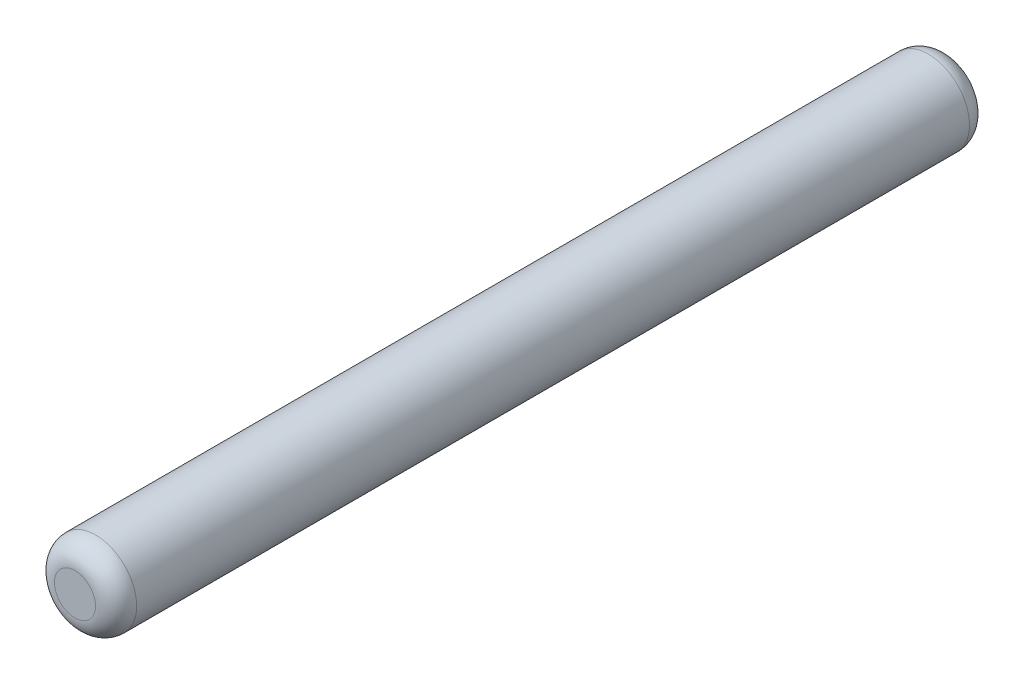
ISO-10303-21;
HEADER;
FILE_DESCRIPTION(('STEP AP214'),'2;1');
FILE_NAME('part.step','',(''),(''),'','','');
FILE_SCHEMA(('AUTOMOTIVE_DESIGN { 1 0 10303 214 1 1 1 1 }'));
ENDSEC;
DATA;
#1=APPLICATION_CONTEXT('core data for automotive mechanical design processes');
#2=APPLICATION_PROTOCOL_DEFINITION('international standard','automotive_design',2000,#1);
#3=PRODUCT_CONTEXT('',#1,'mechanical');
#4=PRODUCT('Part','Part','',(#3));
#5=PRODUCT_RELATED_PRODUCT_CATEGORY('part','',(#4));
#6=PRODUCT_DEFINITION_FORMATION('','',#4);
#7=PRODUCT_DEFINITION_CONTEXT('part definition',#1,'design');
#8=PRODUCT_DEFINITION('design','',#6,#7);
#9=PRODUCT_DEFINITION_SHAPE('','',#8);
#10=(LENGTH_UNIT() NAMED_UNIT(*) SI_UNIT(.MILLI.,.METRE.));
#11=(NAMED_UNIT(*) PLANE_ANGLE_UNIT() SI_UNIT($,.RADIAN.));
#12=(NAMED_UNIT(*) SI_UNIT($,.STERADIAN.) SOLID_ANGLE_UNIT());
#13=UNCERTAINTY_MEASURE_WITH_UNIT(LENGTH_MEASURE(1.E-05),#10,'distance_accuracy_value','');
#14=(GEOMETRIC_REPRESENTATION_CONTEXT(3) GLOBAL_UNCERTAINTY_ASSIGNED_CONTEXT((#13)) GLOBAL_UNIT_ASSIGNED_CONTEXT((#10,
#11,#12)) REPRESENTATION_CONTEXT('',''));
#15=CARTESIAN_POINT('',(0.,0.,0.));
#16=DIRECTION('',(0.,0.,1.));
#17=DIRECTION('',(1.,0.,0.));
#18=AXIS2_PLACEMENT_3D('',#15,#16,#17);
#19=CARTESIAN_POINT('',(0.,0.,42.5));
#20=DIRECTION('',(0.,0.,-1.));
#21=DIRECTION('',(-1.,0.,0.));
#22=AXIS2_PLACEMENT_3D('',#19,#20,#21);
#23=CYLINDRICAL_SURFACE('',#22,2.);
#24=CARTESIAN_POINT('',(0.,0.,1.));
#25=DIRECTION('',(0.,0.,1.));
#26=DIRECTION('',(1.,0.,0.));
#27=AXIS2_PLACEMENT_3D('',#24,#25,#26);
#28=CIRCLE('',#27,2.);
#29=CARTESIAN_POINT('',(2.,0.,1.));
#30=VERTEX_POINT('',#29);
#31=EDGE_CURVE('E42',#30,#30,#28,.T.);
#32=ORIENTED_EDGE('',*,*,#31,.T.);
#33=EDGE_LOOP('',(#32));
#34=FACE_BOUND('',#33,.T.);
#35=CARTESIAN_POINT('',(0.,0.,41.5));
#36=DIRECTION('',(0.,0.,1.));
#37=DIRECTION('',(1.,0.,0.));
#38=AXIS2_PLACEMENT_3D('',#35,#36,#37);
#39=CIRCLE('',#38,2.);
#40=CARTESIAN_POINT('',(2.,0.,41.5));
#41=VERTEX_POINT('',#40);
#42=EDGE_CURVE('E46',#41,#41,#39,.F.);
#43=ORIENTED_EDGE('',*,*,#42,.T.);
#44=EDGE_LOOP('',(#43));
#45=FACE_BOUND('',#44,.T.);
#46=ADVANCED_FACE('F31',(#34,#45),#23,.T.);
#47=CARTESIAN_POINT('',(0.,0.,42.5));
#48=DIRECTION('',(0.,0.,1.));
#49=DIRECTION('',(1.,0.,0.));
#50=AXIS2_PLACEMENT_3D('',#47,#48,#49);
#51=PLANE('',#50);
#52=CARTESIAN_POINT('',(0.,0.,42.5));
#53=DIRECTION('',(0.,0.,1.));
#54=DIRECTION('',(1.,0.,0.));
#55=AXIS2_PLACEMENT_3D('',#52,#53,#54);
#56=CIRCLE('',#55,1.);
#57=CARTESIAN_POINT('',(1.,0.,42.5));
#58=VERTEX_POINT('',#57);
#59=EDGE_CURVE('E10',#58,#58,#56,.T.);
#60=ORIENTED_EDGE('',*,*,#59,.T.);
#61=EDGE_LOOP('',(#60));
#62=FACE_BOUND('',#61,.T.);
#63=ADVANCED_FACE('F62',(#62),#51,.T.);
#64=CARTESIAN_POINT('',(0.,0.,0.));
#65=DIRECTION('',(0.,0.,1.));
#66=DIRECTION('',(1.,0.,0.));
#67=AXIS2_PLACEMENT_3D('',#64,#65,#66);
#68=PLANE('',#67);
#69=CARTESIAN_POINT('',(0.,0.,0.));
#70=DIRECTION('',(0.,0.,1.));
#71=DIRECTION('',(1.,0.,0.));
#72=AXIS2_PLACEMENT_3D('',#69,#70,#71);
#73=CIRCLE('',#72,1.);
#74=CARTESIAN_POINT('',(1.,0.,0.));
#75=VERTEX_POINT('',#74);
#76=EDGE_CURVE('E38',#75,#75,#73,.F.);
#77=ORIENTED_EDGE('',*,*,#76,.T.);
#78=EDGE_LOOP('',(#77));
#79=FACE_BOUND('',#78,.T.);
#80=ADVANCED_FACE('F59',(#79),#68,.F.);
#81=CARTESIAN_POINT('',(0.,0.,1.));
#82=DIRECTION('',(0.,0.,1.));
#83=DIRECTION('',(1.,0.,0.));
#84=AXIS2_PLACEMENT_3D('',#81,#82,#83);
#85=DEGENERATE_TOROIDAL_SURFACE('',#84,1.,1.,.T.);
#86=ORIENTED_EDGE('',*,*,#76,.F.);
#87=EDGE_LOOP('',(#86));
#88=FACE_BOUND('',#87,.T.);
#89=ORIENTED_EDGE('',*,*,#31,.F.);
#90=EDGE_LOOP('',(#89));
#91=FACE_BOUND('',#90,.T.);
#92=ADVANCED_FACE('F55',(#88,#91),#85,.T.);
#93=CARTESIAN_POINT('',(0.,0.,41.5));
#94=DIRECTION('',(0.,0.,1.));
#95=DIRECTION('',(1.,0.,0.));
#96=AXIS2_PLACEMENT_3D('',#93,#94,#95);
#97=DEGENERATE_TOROIDAL_SURFACE('',#96,1.,1.,.T.);
#98=ORIENTED_EDGE('',*,*,#42,.F.);
#99=EDGE_LOOP('',(#98));
#100=FACE_BOUND('',#99,.T.);
#101=ORIENTED_EDGE('',*,*,#59,.F.);
#102=EDGE_LOOP('',(#101));
#103=FACE_BOUND('',#102,.T.);
#104=ADVANCED_FACE('F33',(#100,#103),#97,.T.);
#105=CLOSED_SHELL('',(#46,#63,#80,#92,#104));
#106=MANIFOLD_SOLID_BREP('B2',#105);
#107=ADVANCED_BREP_SHAPE_REPRESENTATION('',(#18,#106),#14);
#108=SHAPE_DEFINITION_REPRESENTATION(#9,#107);
ENDSEC;
END-ISO-10303-21;
